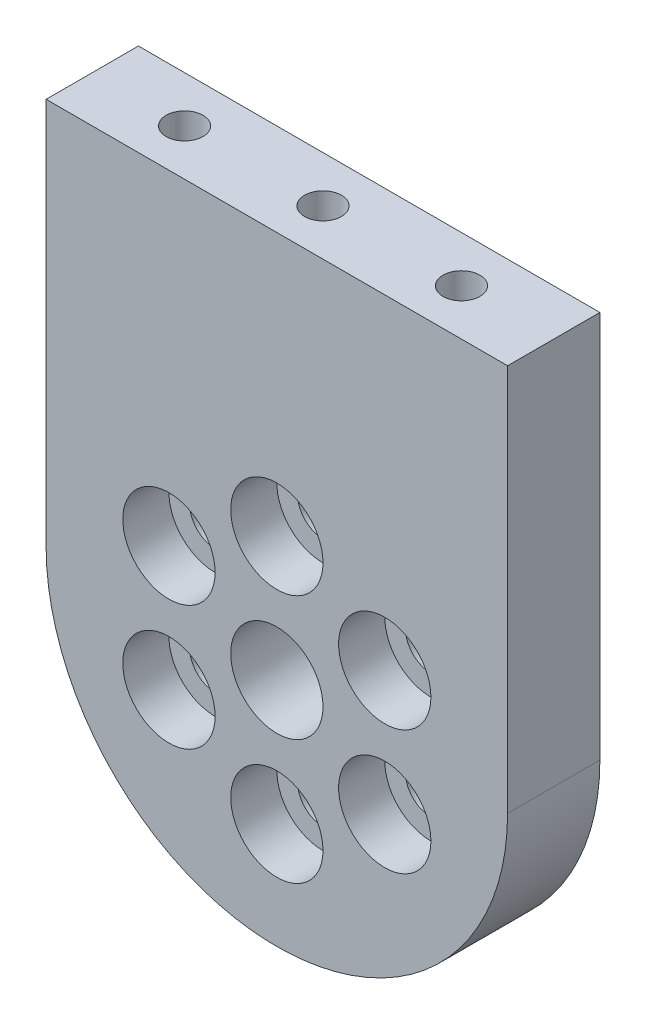
ISO-10303-21;
HEADER;
FILE_DESCRIPTION(('STEP AP214'),'2;1');
FILE_NAME('part.step','',(''),(''),'','','');
FILE_SCHEMA(('AUTOMOTIVE_DESIGN { 1 0 10303 214 1 1 1 1 }'));
ENDSEC;
DATA;
#1=APPLICATION_CONTEXT('core data for automotive mechanical design processes');
#2=APPLICATION_PROTOCOL_DEFINITION('international standard','automotive_design',2000,#1);
#3=PRODUCT_CONTEXT('',#1,'mechanical');
#4=PRODUCT('Part','Part','',(#3));
#5=PRODUCT_RELATED_PRODUCT_CATEGORY('part','',(#4));
#6=PRODUCT_DEFINITION_FORMATION('','',#4);
#7=PRODUCT_DEFINITION_CONTEXT('part definition',#1,'design');
#8=PRODUCT_DEFINITION('design','',#6,#7);
#9=PRODUCT_DEFINITION_SHAPE('','',#8);
#10=(LENGTH_UNIT() NAMED_UNIT(*) SI_UNIT(.MILLI.,.METRE.));
#11=(NAMED_UNIT(*) PLANE_ANGLE_UNIT() SI_UNIT($,.RADIAN.));
#12=(NAMED_UNIT(*) SI_UNIT($,.STERADIAN.) SOLID_ANGLE_UNIT());
#13=UNCERTAINTY_MEASURE_WITH_UNIT(LENGTH_MEASURE(1.E-05),#10,'distance_accuracy_value','');
#14=(GEOMETRIC_REPRESENTATION_CONTEXT(3) GLOBAL_UNCERTAINTY_ASSIGNED_CONTEXT((#13)) GLOBAL_UNIT_ASSIGNED_CONTEXT((#10,
#11,#12)) REPRESENTATION_CONTEXT('',''));
#15=CARTESIAN_POINT('',(0.,0.,0.));
#16=DIRECTION('',(0.,0.,1.));
#17=DIRECTION('',(1.,0.,0.));
#18=AXIS2_PLACEMENT_3D('',#15,#16,#17);
#19=CARTESIAN_POINT('',(-11.6913429510899,6.75000000000005,10.));
#20=DIRECTION('',(0.,0.,-1.));
#21=DIRECTION('',(-1.,0.,0.));
#22=AXIS2_PLACEMENT_3D('',#19,#20,#21);
#23=CYLINDRICAL_SURFACE('',#22,2.75);
#24=CARTESIAN_POINT('',(-11.6913429510899,6.75000000000005,0.));
#25=DIRECTION('',(0.,0.,1.));
#26=DIRECTION('',(1.,0.,0.));
#27=AXIS2_PLACEMENT_3D('',#24,#25,#26);
#28=CIRCLE('',#27,2.75);
#29=CARTESIAN_POINT('',(-8.94134295108989,6.75000000000005,0.));
#30=VERTEX_POINT('',#29);
#31=EDGE_CURVE('E187',#30,#30,#28,.T.);
#32=ORIENTED_EDGE('',*,*,#31,.F.);
#33=EDGE_LOOP('',(#32));
#34=FACE_BOUND('',#33,.T.);
#35=CARTESIAN_POINT('',(-11.6913429510899,6.75000000000005,5.));
#36=DIRECTION('',(0.,0.,1.));
#37=DIRECTION('',(1.,0.,0.));
#38=AXIS2_PLACEMENT_3D('',#35,#36,#37);
#39=CIRCLE('',#38,2.75);
#40=CARTESIAN_POINT('',(-8.94134295108989,6.75000000000005,5.));
#41=VERTEX_POINT('',#40);
#42=EDGE_CURVE('E36',#41,#41,#39,.T.);
#43=ORIENTED_EDGE('',*,*,#42,.T.);
#44=EDGE_LOOP('',(#43));
#45=FACE_BOUND('',#44,.T.);
#46=ADVANCED_FACE('F32',(#34,#45),#23,.F.);
#47=CARTESIAN_POINT('',(-11.6913429510899,-6.74999999999997,10.));
#48=DIRECTION('',(0.,0.,-1.));
#49=DIRECTION('',(-1.,0.,0.));
#50=AXIS2_PLACEMENT_3D('',#47,#48,#49);
#51=CYLINDRICAL_SURFACE('',#50,2.75);
#52=CARTESIAN_POINT('',(-11.6913429510899,-6.74999999999997,0.));
#53=DIRECTION('',(0.,0.,1.));
#54=DIRECTION('',(1.,0.,0.));
#55=AXIS2_PLACEMENT_3D('',#52,#53,#54);
#56=CIRCLE('',#55,2.75);
#57=CARTESIAN_POINT('',(-8.94134295108994,-6.74999999999997,0.));
#58=VERTEX_POINT('',#57);
#59=EDGE_CURVE('E190',#58,#58,#56,.T.);
#60=ORIENTED_EDGE('',*,*,#59,.F.);
#61=EDGE_LOOP('',(#60));
#62=FACE_BOUND('',#61,.T.);
#63=CARTESIAN_POINT('',(-11.6913429510899,-6.74999999999997,5.));
#64=DIRECTION('',(0.,0.,1.));
#65=DIRECTION('',(1.,0.,0.));
#66=AXIS2_PLACEMENT_3D('',#63,#64,#65);
#67=CIRCLE('',#66,2.75);
#68=CARTESIAN_POINT('',(-8.94134295108994,-6.74999999999997,5.));
#69=VERTEX_POINT('',#68);
#70=EDGE_CURVE('E128',#69,#69,#67,.T.);
#71=ORIENTED_EDGE('',*,*,#70,.T.);
#72=EDGE_LOOP('',(#71));
#73=FACE_BOUND('',#72,.T.);
#74=ADVANCED_FACE('F222',(#62,#73),#51,.F.);
#75=CARTESIAN_POINT('',(0.,-13.5,10.));
#76=DIRECTION('',(0.,0.,-1.));
#77=DIRECTION('',(-1.,0.,0.));
#78=AXIS2_PLACEMENT_3D('',#75,#76,#77);
#79=CYLINDRICAL_SURFACE('',#78,2.75);
#80=CARTESIAN_POINT('',(0.,-13.5,0.));
#81=DIRECTION('',(0.,0.,1.));
#82=DIRECTION('',(1.,0.,0.));
#83=AXIS2_PLACEMENT_3D('',#80,#81,#82);
#84=CIRCLE('',#83,2.75);
#85=CARTESIAN_POINT('',(2.75,-13.5,0.));
#86=VERTEX_POINT('',#85);
#87=EDGE_CURVE('E193',#86,#86,#84,.T.);
#88=ORIENTED_EDGE('',*,*,#87,.F.);
#89=EDGE_LOOP('',(#88));
#90=FACE_BOUND('',#89,.T.);
#91=CARTESIAN_POINT('',(0.,-13.5,5.));
#92=DIRECTION('',(0.,0.,1.));
#93=DIRECTION('',(1.,0.,0.));
#94=AXIS2_PLACEMENT_3D('',#91,#92,#93);
#95=CIRCLE('',#94,2.75);
#96=CARTESIAN_POINT('',(2.75,-13.5,5.));
#97=VERTEX_POINT('',#96);
#98=EDGE_CURVE('E124',#97,#97,#95,.T.);
#99=ORIENTED_EDGE('',*,*,#98,.T.);
#100=EDGE_LOOP('',(#99));
#101=FACE_BOUND('',#100,.T.);
#102=ADVANCED_FACE('F228',(#90,#101),#79,.F.);
#103=CARTESIAN_POINT('',(11.6913429510898,-6.75000000000014,10.));
#104=DIRECTION('',(0.,0.,-1.));
#105=DIRECTION('',(-1.,0.,0.));
#106=AXIS2_PLACEMENT_3D('',#103,#104,#105);
#107=CYLINDRICAL_SURFACE('',#106,2.75);
#108=CARTESIAN_POINT('',(11.6913429510898,-6.75000000000014,0.));
#109=DIRECTION('',(0.,0.,1.));
#110=DIRECTION('',(1.,0.,0.));
#111=AXIS2_PLACEMENT_3D('',#108,#109,#110);
#112=CIRCLE('',#111,2.75);
#113=CARTESIAN_POINT('',(14.4413429510898,-6.75000000000014,0.));
#114=VERTEX_POINT('',#113);
#115=EDGE_CURVE('E176',#114,#114,#112,.T.);
#116=ORIENTED_EDGE('',*,*,#115,.F.);
#117=EDGE_LOOP('',(#116));
#118=FACE_BOUND('',#117,.T.);
#119=CARTESIAN_POINT('',(11.6913429510898,-6.75000000000014,5.));
#120=DIRECTION('',(0.,0.,1.));
#121=DIRECTION('',(1.,0.,0.));
#122=AXIS2_PLACEMENT_3D('',#119,#120,#121);
#123=CIRCLE('',#122,2.75);
#124=CARTESIAN_POINT('',(14.4413429510898,-6.75000000000014,5.));
#125=VERTEX_POINT('',#124);
#126=EDGE_CURVE('E119',#125,#125,#123,.T.);
#127=ORIENTED_EDGE('',*,*,#126,.T.);
#128=EDGE_LOOP('',(#127));
#129=FACE_BOUND('',#128,.T.);
#130=ADVANCED_FACE('F237',(#118,#129),#107,.F.);
#131=CARTESIAN_POINT('',(11.69134295109,6.74999999999989,10.));
#132=DIRECTION('',(0.,0.,-1.));
#133=DIRECTION('',(-1.,0.,0.));
#134=AXIS2_PLACEMENT_3D('',#131,#132,#133);
#135=CYLINDRICAL_SURFACE('',#134,2.75);
#136=CARTESIAN_POINT('',(11.69134295109,6.74999999999989,0.));
#137=DIRECTION('',(0.,0.,1.));
#138=DIRECTION('',(1.,0.,0.));
#139=AXIS2_PLACEMENT_3D('',#136,#137,#138);
#140=CIRCLE('',#139,2.75);
#141=CARTESIAN_POINT('',(14.44134295109,6.74999999999989,0.));
#142=VERTEX_POINT('',#141);
#143=EDGE_CURVE('E181',#142,#142,#140,.T.);
#144=ORIENTED_EDGE('',*,*,#143,.F.);
#145=EDGE_LOOP('',(#144));
#146=FACE_BOUND('',#145,.T.);
#147=CARTESIAN_POINT('',(11.69134295109,6.74999999999989,5.));
#148=DIRECTION('',(0.,0.,1.));
#149=DIRECTION('',(1.,0.,0.));
#150=AXIS2_PLACEMENT_3D('',#147,#148,#149);
#151=CIRCLE('',#150,2.75);
#152=CARTESIAN_POINT('',(14.44134295109,6.74999999999989,5.));
#153=VERTEX_POINT('',#152);
#154=EDGE_CURVE('E114',#153,#153,#151,.T.);
#155=ORIENTED_EDGE('',*,*,#154,.T.);
#156=EDGE_LOOP('',(#155));
#157=FACE_BOUND('',#156,.T.);
#158=ADVANCED_FACE('F242',(#146,#157),#135,.F.);
#159=CARTESIAN_POINT('',(0.,13.5,10.));
#160=DIRECTION('',(0.,0.,-1.));
#161=DIRECTION('',(-1.,0.,0.));
#162=AXIS2_PLACEMENT_3D('',#159,#160,#161);
#163=CYLINDRICAL_SURFACE('',#162,2.75);
#164=CARTESIAN_POINT('',(0.,13.5,0.));
#165=DIRECTION('',(0.,0.,1.));
#166=DIRECTION('',(1.,0.,0.));
#167=AXIS2_PLACEMENT_3D('',#164,#165,#166);
#168=CIRCLE('',#167,2.75);
#169=CARTESIAN_POINT('',(2.75000000000009,13.5,0.));
#170=VERTEX_POINT('',#169);
#171=EDGE_CURVE('E184',#170,#170,#168,.T.);
#172=ORIENTED_EDGE('',*,*,#171,.F.);
#173=EDGE_LOOP('',(#172));
#174=FACE_BOUND('',#173,.T.);
#175=CARTESIAN_POINT('',(0.,13.5,5.));
#176=DIRECTION('',(0.,0.,1.));
#177=DIRECTION('',(1.,0.,0.));
#178=AXIS2_PLACEMENT_3D('',#175,#176,#177);
#179=CIRCLE('',#178,2.75);
#180=CARTESIAN_POINT('',(2.75000000000009,13.5,5.));
#181=VERTEX_POINT('',#180);
#182=EDGE_CURVE('E109',#181,#181,#179,.T.);
#183=ORIENTED_EDGE('',*,*,#182,.T.);
#184=EDGE_LOOP('',(#183));
#185=FACE_BOUND('',#184,.T.);
#186=ADVANCED_FACE('F234',(#174,#185),#163,.F.);
#187=CARTESIAN_POINT('',(0.,0.,10.));
#188=DIRECTION('',(0.,0.,1.));
#189=DIRECTION('',(1.,0.,0.));
#190=AXIS2_PLACEMENT_3D('',#187,#188,#189);
#191=PLANE('',#190);
#192=CARTESIAN_POINT('',(-11.6913429510899,6.75000000000005,10.));
#193=DIRECTION('',(0.,0.,1.));
#194=DIRECTION('',(1.,0.,0.));
#195=AXIS2_PLACEMENT_3D('',#192,#193,#194);
#196=CIRCLE('',#195,5.);
#197=CARTESIAN_POINT('',(-6.69134295108989,6.75000000000005,10.));
#198=VERTEX_POINT('',#197);
#199=EDGE_CURVE('E144',#198,#198,#196,.T.);
#200=ORIENTED_EDGE('',*,*,#199,.F.);
#201=EDGE_LOOP('',(#200));
#202=FACE_BOUND('',#201,.T.);
#203=CARTESIAN_POINT('',(-11.6913429510899,-6.74999999999997,10.));
#204=DIRECTION('',(0.,0.,1.));
#205=DIRECTION('',(1.,0.,0.));
#206=AXIS2_PLACEMENT_3D('',#203,#204,#205);
#207=CIRCLE('',#206,5.);
#208=CARTESIAN_POINT('',(-6.69134295108994,-6.74999999999997,10.));
#209=VERTEX_POINT('',#208);
#210=EDGE_CURVE('E137',#209,#209,#207,.T.);
#211=ORIENTED_EDGE('',*,*,#210,.F.);
#212=EDGE_LOOP('',(#211));
#213=FACE_BOUND('',#212,.T.);
#214=CARTESIAN_POINT('',(0.,-13.5,10.));
#215=DIRECTION('',(0.,0.,1.));
#216=DIRECTION('',(1.,0.,0.));
#217=AXIS2_PLACEMENT_3D('',#214,#215,#216);
#218=CIRCLE('',#217,5.);
#219=CARTESIAN_POINT('',(5.,-13.5,10.));
#220=VERTEX_POINT('',#219);
#221=EDGE_CURVE('E130',#220,#220,#218,.T.);
#222=ORIENTED_EDGE('',*,*,#221,.F.);
#223=EDGE_LOOP('',(#222));
#224=FACE_BOUND('',#223,.T.);
#225=CARTESIAN_POINT('',(11.6913429510898,-6.75000000000014,10.));
#226=DIRECTION('',(0.,0.,1.));
#227=DIRECTION('',(1.,0.,0.));
#228=AXIS2_PLACEMENT_3D('',#225,#226,#227);
#229=CIRCLE('',#228,5.);
#230=CARTESIAN_POINT('',(16.6913429510898,-6.75000000000014,10.));
#231=VERTEX_POINT('',#230);
#232=EDGE_CURVE('E126',#231,#231,#229,.T.);
#233=ORIENTED_EDGE('',*,*,#232,.F.);
#234=EDGE_LOOP('',(#233));
#235=FACE_BOUND('',#234,.T.);
#236=CARTESIAN_POINT('',(11.69134295109,6.74999999999989,10.));
#237=DIRECTION('',(0.,0.,1.));
#238=DIRECTION('',(1.,0.,0.));
#239=AXIS2_PLACEMENT_3D('',#236,#237,#238);
#240=CIRCLE('',#239,5.);
#241=CARTESIAN_POINT('',(16.69134295109,6.74999999999989,10.));
#242=VERTEX_POINT('',#241);
#243=EDGE_CURVE('E122',#242,#242,#240,.T.);
#244=ORIENTED_EDGE('',*,*,#243,.F.);
#245=EDGE_LOOP('',(#244));
#246=FACE_BOUND('',#245,.T.);
#247=CARTESIAN_POINT('',(0.,13.5,10.));
#248=DIRECTION('',(0.,0.,1.));
#249=DIRECTION('',(1.,0.,0.));
#250=AXIS2_PLACEMENT_3D('',#247,#248,#249);
#251=CIRCLE('',#250,5.);
#252=CARTESIAN_POINT('',(5.0000000000001,13.5,10.));
#253=VERTEX_POINT('',#252);
#254=EDGE_CURVE('E117',#253,#253,#251,.T.);
#255=ORIENTED_EDGE('',*,*,#254,.F.);
#256=EDGE_LOOP('',(#255));
#257=FACE_BOUND('',#256,.T.);
#258=CARTESIAN_POINT('',(0.,0.,10.));
#259=DIRECTION('',(0.,0.,1.));
#260=DIRECTION('',(1.,0.,0.));
#261=AXIS2_PLACEMENT_3D('',#258,#259,#260);
#262=CIRCLE('',#261,25.);
#263=CARTESIAN_POINT('',(-25.,0.,10.));
#264=VERTEX_POINT('',#263);
#265=CARTESIAN_POINT('',(25.,0.,10.));
#266=VERTEX_POINT('',#265);
#267=EDGE_CURVE('E87',#264,#266,#262,.T.);
#268=ORIENTED_EDGE('',*,*,#267,.T.);
#269=DIRECTION('',(0.,1.,0.));
#270=VECTOR('',#269,1.);
#271=CARTESIAN_POINT('',(25.,0.,10.));
#272=LINE('',#271,#270);
#273=CARTESIAN_POINT('',(25.,42.,10.));
#274=VERTEX_POINT('',#273);
#275=EDGE_CURVE('E81',#266,#274,#272,.T.);
#276=ORIENTED_EDGE('',*,*,#275,.T.);
#277=DIRECTION('',(-1.,0.,0.));
#278=VECTOR('',#277,1.);
#279=CARTESIAN_POINT('',(-25.,42.,10.));
#280=LINE('',#279,#278);
#281=CARTESIAN_POINT('',(-25.,42.,10.));
#282=VERTEX_POINT('',#281);
#283=EDGE_CURVE('E85',#274,#282,#280,.T.);
#284=ORIENTED_EDGE('',*,*,#283,.T.);
#285=DIRECTION('',(0.,-1.,0.));
#286=VECTOR('',#285,1.);
#287=CARTESIAN_POINT('',(-25.,0.,10.));
#288=LINE('',#287,#286);
#289=EDGE_CURVE('E51',#282,#264,#288,.T.);
#290=ORIENTED_EDGE('',*,*,#289,.T.);
#291=EDGE_LOOP('',(#268,#276,#284,#290));
#292=FACE_BOUND('',#291,.T.);
#293=CARTESIAN_POINT('',(0.,0.,10.));
#294=DIRECTION('',(0.,0.,1.));
#295=DIRECTION('',(1.,0.,0.));
#296=AXIS2_PLACEMENT_3D('',#293,#294,#295);
#297=CIRCLE('',#296,5.);
#298=CARTESIAN_POINT('',(5.,0.,10.));
#299=VERTEX_POINT('',#298);
#300=EDGE_CURVE('E103',#299,#299,#297,.T.);
#301=ORIENTED_EDGE('',*,*,#300,.F.);
#302=EDGE_LOOP('',(#301));
#303=FACE_BOUND('',#302,.T.);
#304=ADVANCED_FACE('F82',(#202,#213,#224,#235,#246,#257,#292,#303),#191,.T.);
#305=CARTESIAN_POINT('',(0.,0.,0.));
#306=DIRECTION('',(0.,0.,1.));
#307=DIRECTION('',(1.,0.,0.));
#308=AXIS2_PLACEMENT_3D('',#305,#306,#307);
#309=PLANE('',#308);
#310=ORIENTED_EDGE('',*,*,#143,.T.);
#311=EDGE_LOOP('',(#310));
#312=FACE_BOUND('',#311,.T.);
#313=ORIENTED_EDGE('',*,*,#31,.T.);
#314=EDGE_LOOP('',(#313));
#315=FACE_BOUND('',#314,.T.);
#316=ORIENTED_EDGE('',*,*,#87,.T.);
#317=EDGE_LOOP('',(#316));
#318=FACE_BOUND('',#317,.T.);
#319=CARTESIAN_POINT('',(0.,0.,0.));
#320=DIRECTION('',(0.,0.,1.));
#321=DIRECTION('',(1.,0.,0.));
#322=AXIS2_PLACEMENT_3D('',#319,#320,#321);
#323=CIRCLE('',#322,25.);
#324=CARTESIAN_POINT('',(-25.,0.,0.));
#325=VERTEX_POINT('',#324);
#326=CARTESIAN_POINT('',(25.,0.,0.));
#327=VERTEX_POINT('',#326);
#328=EDGE_CURVE('E100',#325,#327,#323,.T.);
#329=ORIENTED_EDGE('',*,*,#328,.F.);
#330=DIRECTION('',(0.,-1.,0.));
#331=VECTOR('',#330,1.);
#332=CARTESIAN_POINT('',(-25.,0.,0.));
#333=LINE('',#332,#331);
#334=CARTESIAN_POINT('',(-25.,42.,0.));
#335=VERTEX_POINT('',#334);
#336=EDGE_CURVE('E74',#335,#325,#333,.T.);
#337=ORIENTED_EDGE('',*,*,#336,.F.);
#338=DIRECTION('',(-1.,0.,0.));
#339=VECTOR('',#338,1.);
#340=CARTESIAN_POINT('',(-25.,42.,0.));
#341=LINE('',#340,#339);
#342=CARTESIAN_POINT('',(25.,42.,0.));
#343=VERTEX_POINT('',#342);
#344=EDGE_CURVE('E68',#343,#335,#341,.T.);
#345=ORIENTED_EDGE('',*,*,#344,.F.);
#346=DIRECTION('',(0.,1.,0.));
#347=VECTOR('',#346,1.);
#348=CARTESIAN_POINT('',(25.,0.,0.));
#349=LINE('',#348,#347);
#350=EDGE_CURVE('E91',#327,#343,#349,.T.);
#351=ORIENTED_EDGE('',*,*,#350,.F.);
#352=EDGE_LOOP('',(#329,#337,#345,#351));
#353=FACE_BOUND('',#352,.T.);
#354=CARTESIAN_POINT('',(0.,0.,0.));
#355=DIRECTION('',(0.,0.,1.));
#356=DIRECTION('',(1.,0.,0.));
#357=AXIS2_PLACEMENT_3D('',#354,#355,#356);
#358=CIRCLE('',#357,5.);
#359=CARTESIAN_POINT('',(5.,0.,0.));
#360=VERTEX_POINT('',#359);
#361=EDGE_CURVE('E196',#360,#360,#358,.T.);
#362=ORIENTED_EDGE('',*,*,#361,.T.);
#363=EDGE_LOOP('',(#362));
#364=FACE_BOUND('',#363,.T.);
#365=ORIENTED_EDGE('',*,*,#59,.T.);
#366=EDGE_LOOP('',(#365));
#367=FACE_BOUND('',#366,.T.);
#368=ORIENTED_EDGE('',*,*,#171,.T.);
#369=EDGE_LOOP('',(#368));
#370=FACE_BOUND('',#369,.T.);
#371=ORIENTED_EDGE('',*,*,#115,.T.);
#372=EDGE_LOOP('',(#371));
#373=FACE_BOUND('',#372,.T.);
#374=ADVANCED_FACE('F202',(#312,#315,#318,#353,#364,#367,#370,#373),#309,.F.);
#375=CARTESIAN_POINT('',(0.,0.,10.));
#376=DIRECTION('',(0.,0.,-1.));
#377=DIRECTION('',(-1.,0.,0.));
#378=AXIS2_PLACEMENT_3D('',#375,#376,#377);
#379=CYLINDRICAL_SURFACE('',#378,25.);
#380=ORIENTED_EDGE('',*,*,#328,.T.);
#381=DIRECTION('',(0.,0.,-1.));
#382=VECTOR('',#381,1.);
#383=CARTESIAN_POINT('',(25.,0.,10.));
#384=LINE('',#383,#382);
#385=EDGE_CURVE('E11',#266,#327,#384,.T.);
#386=ORIENTED_EDGE('',*,*,#385,.F.);
#387=ORIENTED_EDGE('',*,*,#267,.F.);
#388=DIRECTION('',(0.,0.,-1.));
#389=VECTOR('',#388,1.);
#390=CARTESIAN_POINT('',(-25.,0.,10.));
#391=LINE('',#390,#389);
#392=EDGE_CURVE('E96',#264,#325,#391,.T.);
#393=ORIENTED_EDGE('',*,*,#392,.T.);
#394=EDGE_LOOP('',(#380,#386,#387,#393));
#395=FACE_BOUND('',#394,.T.);
#396=ADVANCED_FACE('F34',(#395),#379,.T.);
#397=CARTESIAN_POINT('',(25.,0.,10.));
#398=DIRECTION('',(-1.,0.,0.));
#399=DIRECTION('',(0.,-1.,0.));
#400=AXIS2_PLACEMENT_3D('',#397,#398,#399);
#401=PLANE('',#400);
#402=ORIENTED_EDGE('',*,*,#350,.T.);
#403=DIRECTION('',(0.,0.,-1.));
#404=VECTOR('',#403,1.);
#405=CARTESIAN_POINT('',(25.,42.,10.));
#406=LINE('',#405,#404);
#407=EDGE_CURVE('E42',#274,#343,#406,.T.);
#408=ORIENTED_EDGE('',*,*,#407,.F.);
#409=ORIENTED_EDGE('',*,*,#275,.F.);
#410=ORIENTED_EDGE('',*,*,#385,.T.);
#411=EDGE_LOOP('',(#402,#408,#409,#410));
#412=FACE_BOUND('',#411,.T.);
#413=ADVANCED_FACE('F90',(#412),#401,.F.);
#414=CARTESIAN_POINT('',(-25.,42.,10.));
#415=DIRECTION('',(0.,-1.,0.));
#416=DIRECTION('',(0.,0.,-1.));
#417=AXIS2_PLACEMENT_3D('',#414,#415,#416);
#418=PLANE('',#417);
#419=CARTESIAN_POINT('',(-15.,42.,5.00000000000001));
#420=DIRECTION('',(0.,1.,0.));
#421=DIRECTION('',(0.,0.,1.));
#422=AXIS2_PLACEMENT_3D('',#419,#420,#421);
#423=CIRCLE('',#422,2.);
#424=CARTESIAN_POINT('',(-15.,42.,7.00000000000001));
#425=VERTEX_POINT('',#424);
#426=EDGE_CURVE('E112',#425,#425,#423,.T.);
#427=ORIENTED_EDGE('',*,*,#426,.F.);
#428=EDGE_LOOP('',(#427));
#429=FACE_BOUND('',#428,.T.);
#430=CARTESIAN_POINT('',(15.,42.,5.00000000000001));
#431=DIRECTION('',(0.,1.,0.));
#432=DIRECTION('',(0.,0.,1.));
#433=AXIS2_PLACEMENT_3D('',#430,#431,#432);
#434=CIRCLE('',#433,2.);
#435=CARTESIAN_POINT('',(15.,42.,7.00000000000001));
#436=VERTEX_POINT('',#435);
#437=EDGE_CURVE('E164',#436,#436,#434,.T.);
#438=ORIENTED_EDGE('',*,*,#437,.F.);
#439=EDGE_LOOP('',(#438));
#440=FACE_BOUND('',#439,.T.);
#441=CARTESIAN_POINT('',(0.,42.,5.));
#442=DIRECTION('',(0.,1.,0.));
#443=DIRECTION('',(0.,0.,1.));
#444=AXIS2_PLACEMENT_3D('',#441,#442,#443);
#445=CIRCLE('',#444,2.);
#446=CARTESIAN_POINT('',(0.,42.,7.));
#447=VERTEX_POINT('',#446);
#448=EDGE_CURVE('E170',#447,#447,#445,.T.);
#449=ORIENTED_EDGE('',*,*,#448,.F.);
#450=EDGE_LOOP('',(#449));
#451=FACE_BOUND('',#450,.T.);
#452=ORIENTED_EDGE('',*,*,#344,.T.);
#453=DIRECTION('',(0.,0.,-1.));
#454=VECTOR('',#453,1.);
#455=CARTESIAN_POINT('',(-25.,42.,10.));
#456=LINE('',#455,#454);
#457=EDGE_CURVE('E92',#282,#335,#456,.T.);
#458=ORIENTED_EDGE('',*,*,#457,.F.);
#459=ORIENTED_EDGE('',*,*,#283,.F.);
#460=ORIENTED_EDGE('',*,*,#407,.T.);
#461=EDGE_LOOP('',(#452,#458,#459,#460));
#462=FACE_BOUND('',#461,.T.);
#463=ADVANCED_FACE('F94',(#429,#440,#451,#462),#418,.F.);
#464=CARTESIAN_POINT('',(-25.,0.,10.));
#465=DIRECTION('',(1.,0.,0.));
#466=DIRECTION('',(0.,1.,0.));
#467=AXIS2_PLACEMENT_3D('',#464,#465,#466);
#468=PLANE('',#467);
#469=ORIENTED_EDGE('',*,*,#336,.T.);
#470=ORIENTED_EDGE('',*,*,#392,.F.);
#471=ORIENTED_EDGE('',*,*,#289,.F.);
#472=ORIENTED_EDGE('',*,*,#457,.T.);
#473=EDGE_LOOP('',(#469,#470,#471,#472));
#474=FACE_BOUND('',#473,.T.);
#475=ADVANCED_FACE('F208',(#474),#468,.F.);
#476=CARTESIAN_POINT('',(0.,0.,10.));
#477=DIRECTION('',(0.,0.,-1.));
#478=DIRECTION('',(-1.,0.,0.));
#479=AXIS2_PLACEMENT_3D('',#476,#477,#478);
#480=CYLINDRICAL_SURFACE('',#479,5.);
#481=ORIENTED_EDGE('',*,*,#300,.T.);
#482=EDGE_LOOP('',(#481));
#483=FACE_BOUND('',#482,.T.);
#484=ORIENTED_EDGE('',*,*,#361,.F.);
#485=EDGE_LOOP('',(#484));
#486=FACE_BOUND('',#485,.T.);
#487=ADVANCED_FACE('F205',(#483,#486),#480,.F.);
#488=CARTESIAN_POINT('',(0.,22.,5.));
#489=DIRECTION('',(0.,1.,0.));
#490=DIRECTION('',(0.,0.,1.));
#491=AXIS2_PLACEMENT_3D('',#488,#489,#490);
#492=CYLINDRICAL_SURFACE('',#491,2.);
#493=CARTESIAN_POINT('',(0.,22.,5.));
#494=DIRECTION('',(0.,1.,0.));
#495=DIRECTION('',(0.,0.,1.));
#496=AXIS2_PLACEMENT_3D('',#493,#494,#495);
#497=CIRCLE('',#496,2.);
#498=CARTESIAN_POINT('',(0.,22.,7.));
#499=VERTEX_POINT('',#498);
#500=EDGE_CURVE('E173',#499,#499,#497,.T.);
#501=ORIENTED_EDGE('',*,*,#500,.F.);
#502=EDGE_LOOP('',(#501));
#503=FACE_BOUND('',#502,.T.);
#504=ORIENTED_EDGE('',*,*,#448,.T.);
#505=EDGE_LOOP('',(#504));
#506=FACE_BOUND('',#505,.T.);
#507=ADVANCED_FACE('F207',(#503,#506),#492,.F.);
#508=CARTESIAN_POINT('',(0.,22.,5.));
#509=DIRECTION('',(0.,1.,0.));
#510=DIRECTION('',(0.,0.,1.));
#511=AXIS2_PLACEMENT_3D('',#508,#509,#510);
#512=PLANE('',#511);
#513=ORIENTED_EDGE('',*,*,#500,.T.);
#514=EDGE_LOOP('',(#513));
#515=FACE_BOUND('',#514,.T.);
#516=ADVANCED_FACE('F215',(#515),#512,.T.);
#517=CARTESIAN_POINT('',(15.,22.,5.00000000000001));
#518=DIRECTION('',(0.,1.,0.));
#519=DIRECTION('',(0.,0.,1.));
#520=AXIS2_PLACEMENT_3D('',#517,#518,#519);
#521=CYLINDRICAL_SURFACE('',#520,2.);
#522=CARTESIAN_POINT('',(15.,22.,5.00000000000001));
#523=DIRECTION('',(0.,1.,0.));
#524=DIRECTION('',(0.,0.,1.));
#525=AXIS2_PLACEMENT_3D('',#522,#523,#524);
#526=CIRCLE('',#525,2.);
#527=CARTESIAN_POINT('',(15.,22.,7.00000000000001));
#528=VERTEX_POINT('',#527);
#529=EDGE_CURVE('E167',#528,#528,#526,.T.);
#530=ORIENTED_EDGE('',*,*,#529,.F.);
#531=EDGE_LOOP('',(#530));
#532=FACE_BOUND('',#531,.T.);
#533=ORIENTED_EDGE('',*,*,#437,.T.);
#534=EDGE_LOOP('',(#533));
#535=FACE_BOUND('',#534,.T.);
#536=ADVANCED_FACE('F297',(#532,#535),#521,.F.);
#537=CARTESIAN_POINT('',(15.,22.,5.00000000000001));
#538=DIRECTION('',(0.,1.,0.));
#539=DIRECTION('',(0.,0.,1.));
#540=AXIS2_PLACEMENT_3D('',#537,#538,#539);
#541=PLANE('',#540);
#542=ORIENTED_EDGE('',*,*,#529,.T.);
#543=EDGE_LOOP('',(#542));
#544=FACE_BOUND('',#543,.T.);
#545=ADVANCED_FACE('F293',(#544),#541,.T.);
#546=CARTESIAN_POINT('',(-15.,22.,5.00000000000001));
#547=DIRECTION('',(0.,1.,0.));
#548=DIRECTION('',(0.,0.,1.));
#549=AXIS2_PLACEMENT_3D('',#546,#547,#548);
#550=CYLINDRICAL_SURFACE('',#549,2.);
#551=CARTESIAN_POINT('',(-15.,22.,5.00000000000001));
#552=DIRECTION('',(0.,1.,0.));
#553=DIRECTION('',(0.,0.,1.));
#554=AXIS2_PLACEMENT_3D('',#551,#552,#553);
#555=CIRCLE('',#554,2.);
#556=CARTESIAN_POINT('',(-15.,22.,7.00000000000001));
#557=VERTEX_POINT('',#556);
#558=EDGE_CURVE('E161',#557,#557,#555,.T.);
#559=ORIENTED_EDGE('',*,*,#558,.F.);
#560=EDGE_LOOP('',(#559));
#561=FACE_BOUND('',#560,.T.);
#562=ORIENTED_EDGE('',*,*,#426,.T.);
#563=EDGE_LOOP('',(#562));
#564=FACE_BOUND('',#563,.T.);
#565=ADVANCED_FACE('F285',(#561,#564),#550,.F.);
#566=CARTESIAN_POINT('',(-15.,22.,5.00000000000001));
#567=DIRECTION('',(0.,1.,0.));
#568=DIRECTION('',(0.,0.,1.));
#569=AXIS2_PLACEMENT_3D('',#566,#567,#568);
#570=PLANE('',#569);
#571=ORIENTED_EDGE('',*,*,#558,.T.);
#572=EDGE_LOOP('',(#571));
#573=FACE_BOUND('',#572,.T.);
#574=ADVANCED_FACE('F275',(#573),#570,.T.);
#575=CARTESIAN_POINT('',(0.,13.5,5.));
#576=DIRECTION('',(0.,0.,1.));
#577=DIRECTION('',(1.,0.,0.));
#578=AXIS2_PLACEMENT_3D('',#575,#576,#577);
#579=CYLINDRICAL_SURFACE('',#578,5.);
#580=CARTESIAN_POINT('',(0.,13.5,5.));
#581=DIRECTION('',(0.,0.,1.));
#582=DIRECTION('',(1.,0.,0.));
#583=AXIS2_PLACEMENT_3D('',#580,#581,#582);
#584=CIRCLE('',#583,5.);
#585=CARTESIAN_POINT('',(5.0000000000001,13.5,5.));
#586=VERTEX_POINT('',#585);
#587=EDGE_CURVE('E113',#586,#586,#584,.T.);
#588=ORIENTED_EDGE('',*,*,#587,.F.);
#589=EDGE_LOOP('',(#588));
#590=FACE_BOUND('',#589,.T.);
#591=ORIENTED_EDGE('',*,*,#254,.T.);
#592=EDGE_LOOP('',(#591));
#593=FACE_BOUND('',#592,.T.);
#594=ADVANCED_FACE('F272',(#590,#593),#579,.F.);
#595=CARTESIAN_POINT('',(0.,13.5,5.));
#596=DIRECTION('',(0.,0.,1.));
#597=DIRECTION('',(1.,0.,0.));
#598=AXIS2_PLACEMENT_3D('',#595,#596,#597);
#599=PLANE('',#598);
#600=ORIENTED_EDGE('',*,*,#182,.F.);
#601=EDGE_LOOP('',(#600));
#602=FACE_BOUND('',#601,.T.);
#603=ORIENTED_EDGE('',*,*,#587,.T.);
#604=EDGE_LOOP('',(#603));
#605=FACE_BOUND('',#604,.T.);
#606=ADVANCED_FACE('F274',(#602,#605),#599,.T.);
#607=CARTESIAN_POINT('',(11.69134295109,6.74999999999989,5.));
#608=DIRECTION('',(0.,0.,1.));
#609=DIRECTION('',(1.,0.,0.));
#610=AXIS2_PLACEMENT_3D('',#607,#608,#609);
#611=CYLINDRICAL_SURFACE('',#610,5.);
#612=CARTESIAN_POINT('',(11.69134295109,6.74999999999989,5.));
#613=DIRECTION('',(0.,0.,1.));
#614=DIRECTION('',(1.,0.,0.));
#615=AXIS2_PLACEMENT_3D('',#612,#613,#614);
#616=CIRCLE('',#615,5.);
#617=CARTESIAN_POINT('',(16.69134295109,6.74999999999989,5.));
#618=VERTEX_POINT('',#617);
#619=EDGE_CURVE('E118',#618,#618,#616,.T.);
#620=ORIENTED_EDGE('',*,*,#619,.F.);
#621=EDGE_LOOP('',(#620));
#622=FACE_BOUND('',#621,.T.);
#623=ORIENTED_EDGE('',*,*,#243,.T.);
#624=EDGE_LOOP('',(#623));
#625=FACE_BOUND('',#624,.T.);
#626=ADVANCED_FACE('F282',(#622,#625),#611,.F.);
#627=CARTESIAN_POINT('',(11.69134295109,6.74999999999989,5.));
#628=DIRECTION('',(0.,0.,1.));
#629=DIRECTION('',(1.,0.,0.));
#630=AXIS2_PLACEMENT_3D('',#627,#628,#629);
#631=PLANE('',#630);
#632=ORIENTED_EDGE('',*,*,#154,.F.);
#633=EDGE_LOOP('',(#632));
#634=FACE_BOUND('',#633,.T.);
#635=ORIENTED_EDGE('',*,*,#619,.T.);
#636=EDGE_LOOP('',(#635));
#637=FACE_BOUND('',#636,.T.);
#638=ADVANCED_FACE('F314',(#634,#637),#631,.T.);
#639=CARTESIAN_POINT('',(11.6913429510898,-6.75000000000014,5.));
#640=DIRECTION('',(0.,0.,1.));
#641=DIRECTION('',(1.,0.,0.));
#642=AXIS2_PLACEMENT_3D('',#639,#640,#641);
#643=CYLINDRICAL_SURFACE('',#642,5.);
#644=CARTESIAN_POINT('',(11.6913429510898,-6.75000000000014,5.));
#645=DIRECTION('',(0.,0.,1.));
#646=DIRECTION('',(1.,0.,0.));
#647=AXIS2_PLACEMENT_3D('',#644,#645,#646);
#648=CIRCLE('',#647,5.);
#649=CARTESIAN_POINT('',(16.6913429510898,-6.75000000000014,5.));
#650=VERTEX_POINT('',#649);
#651=EDGE_CURVE('E123',#650,#650,#648,.T.);
#652=ORIENTED_EDGE('',*,*,#651,.F.);
#653=EDGE_LOOP('',(#652));
#654=FACE_BOUND('',#653,.T.);
#655=ORIENTED_EDGE('',*,*,#232,.T.);
#656=EDGE_LOOP('',(#655));
#657=FACE_BOUND('',#656,.T.);
#658=ADVANCED_FACE('F317',(#654,#657),#643,.F.);
#659=CARTESIAN_POINT('',(11.6913429510898,-6.75000000000014,5.));
#660=DIRECTION('',(0.,0.,1.));
#661=DIRECTION('',(1.,0.,0.));
#662=AXIS2_PLACEMENT_3D('',#659,#660,#661);
#663=PLANE('',#662);
#664=ORIENTED_EDGE('',*,*,#126,.F.);
#665=EDGE_LOOP('',(#664));
#666=FACE_BOUND('',#665,.T.);
#667=ORIENTED_EDGE('',*,*,#651,.T.);
#668=EDGE_LOOP('',(#667));
#669=FACE_BOUND('',#668,.T.);
#670=ADVANCED_FACE('F259',(#666,#669),#663,.T.);
#671=CARTESIAN_POINT('',(0.,-13.5,5.));
#672=DIRECTION('',(0.,0.,1.));
#673=DIRECTION('',(1.,0.,0.));
#674=AXIS2_PLACEMENT_3D('',#671,#672,#673);
#675=CYLINDRICAL_SURFACE('',#674,5.);
#676=CARTESIAN_POINT('',(0.,-13.5,5.));
#677=DIRECTION('',(0.,0.,1.));
#678=DIRECTION('',(1.,0.,0.));
#679=AXIS2_PLACEMENT_3D('',#676,#677,#678);
#680=CIRCLE('',#679,5.);
#681=CARTESIAN_POINT('',(5.,-13.5,5.));
#682=VERTEX_POINT('',#681);
#683=EDGE_CURVE('E127',#682,#682,#680,.T.);
#684=ORIENTED_EDGE('',*,*,#683,.F.);
#685=EDGE_LOOP('',(#684));
#686=FACE_BOUND('',#685,.T.);
#687=ORIENTED_EDGE('',*,*,#221,.T.);
#688=EDGE_LOOP('',(#687));
#689=FACE_BOUND('',#688,.T.);
#690=ADVANCED_FACE('F253',(#686,#689),#675,.F.);
#691=CARTESIAN_POINT('',(0.,-13.5,5.));
#692=DIRECTION('',(0.,0.,1.));
#693=DIRECTION('',(1.,0.,0.));
#694=AXIS2_PLACEMENT_3D('',#691,#692,#693);
#695=PLANE('',#694);
#696=ORIENTED_EDGE('',*,*,#98,.F.);
#697=EDGE_LOOP('',(#696));
#698=FACE_BOUND('',#697,.T.);
#699=ORIENTED_EDGE('',*,*,#683,.T.);
#700=EDGE_LOOP('',(#699));
#701=FACE_BOUND('',#700,.T.);
#702=ADVANCED_FACE('F249',(#698,#701),#695,.T.);
#703=CARTESIAN_POINT('',(-11.6913429510899,-6.74999999999997,5.));
#704=DIRECTION('',(0.,0.,1.));
#705=DIRECTION('',(1.,0.,0.));
#706=AXIS2_PLACEMENT_3D('',#703,#704,#705);
#707=CYLINDRICAL_SURFACE('',#706,5.);
#708=CARTESIAN_POINT('',(-11.6913429510899,-6.74999999999997,5.));
#709=DIRECTION('',(0.,0.,1.));
#710=DIRECTION('',(1.,0.,0.));
#711=AXIS2_PLACEMENT_3D('',#708,#709,#710);
#712=CIRCLE('',#711,5.);
#713=CARTESIAN_POINT('',(-6.69134295108994,-6.74999999999997,5.));
#714=VERTEX_POINT('',#713);
#715=EDGE_CURVE('E131',#714,#714,#712,.T.);
#716=ORIENTED_EDGE('',*,*,#715,.F.);
#717=EDGE_LOOP('',(#716));
#718=FACE_BOUND('',#717,.T.);
#719=ORIENTED_EDGE('',*,*,#210,.T.);
#720=EDGE_LOOP('',(#719));
#721=FACE_BOUND('',#720,.T.);
#722=ADVANCED_FACE('F252',(#718,#721),#707,.F.);
#723=CARTESIAN_POINT('',(-11.6913429510899,-6.74999999999997,5.));
#724=DIRECTION('',(0.,0.,1.));
#725=DIRECTION('',(1.,0.,0.));
#726=AXIS2_PLACEMENT_3D('',#723,#724,#725);
#727=PLANE('',#726);
#728=ORIENTED_EDGE('',*,*,#70,.F.);
#729=EDGE_LOOP('',(#728));
#730=FACE_BOUND('',#729,.T.);
#731=ORIENTED_EDGE('',*,*,#715,.T.);
#732=EDGE_LOOP('',(#731));
#733=FACE_BOUND('',#732,.T.);
#734=ADVANCED_FACE('F334',(#730,#733),#727,.T.);
#735=CARTESIAN_POINT('',(-11.6913429510899,6.75000000000005,5.));
#736=DIRECTION('',(0.,0.,1.));
#737=DIRECTION('',(1.,0.,0.));
#738=AXIS2_PLACEMENT_3D('',#735,#736,#737);
#739=CYLINDRICAL_SURFACE('',#738,5.);
#740=CARTESIAN_POINT('',(-11.6913429510899,6.75000000000005,5.));
#741=DIRECTION('',(0.,0.,1.));
#742=DIRECTION('',(1.,0.,0.));
#743=AXIS2_PLACEMENT_3D('',#740,#741,#742);
#744=CIRCLE('',#743,5.);
#745=CARTESIAN_POINT('',(-6.69134295108989,6.75000000000005,5.));
#746=VERTEX_POINT('',#745);
#747=EDGE_CURVE('E353',#746,#746,#744,.T.);
#748=ORIENTED_EDGE('',*,*,#747,.F.);
#749=EDGE_LOOP('',(#748));
#750=FACE_BOUND('',#749,.T.);
#751=ORIENTED_EDGE('',*,*,#199,.T.);
#752=EDGE_LOOP('',(#751));
#753=FACE_BOUND('',#752,.T.);
#754=ADVANCED_FACE('F338',(#750,#753),#739,.F.);
#755=CARTESIAN_POINT('',(-11.6913429510899,6.75000000000005,5.));
#756=DIRECTION('',(0.,0.,1.));
#757=DIRECTION('',(1.,0.,0.));
#758=AXIS2_PLACEMENT_3D('',#755,#756,#757);
#759=PLANE('',#758);
#760=ORIENTED_EDGE('',*,*,#42,.F.);
#761=EDGE_LOOP('',(#760));
#762=FACE_BOUND('',#761,.T.);
#763=ORIENTED_EDGE('',*,*,#747,.T.);
#764=EDGE_LOOP('',(#763));
#765=FACE_BOUND('',#764,.T.);
#766=ADVANCED_FACE('F342',(#762,#765),#759,.T.);
#767=CLOSED_SHELL('',(#46,#74,#102,#130,#158,#186,#304,#374,#396,#413,#463,#475,#487,#507,#516,
#536,#545,#565,#574,#594,#606,#626,#638,#658,#670,#690,#702,#722,#734,#754,#766));
#768=MANIFOLD_SOLID_BREP('B2',#767);
#769=ADVANCED_BREP_SHAPE_REPRESENTATION('',(#18,#768),#14);
#770=SHAPE_DEFINITION_REPRESENTATION(#9,#769);
ENDSEC;
END-ISO-10303-21;
